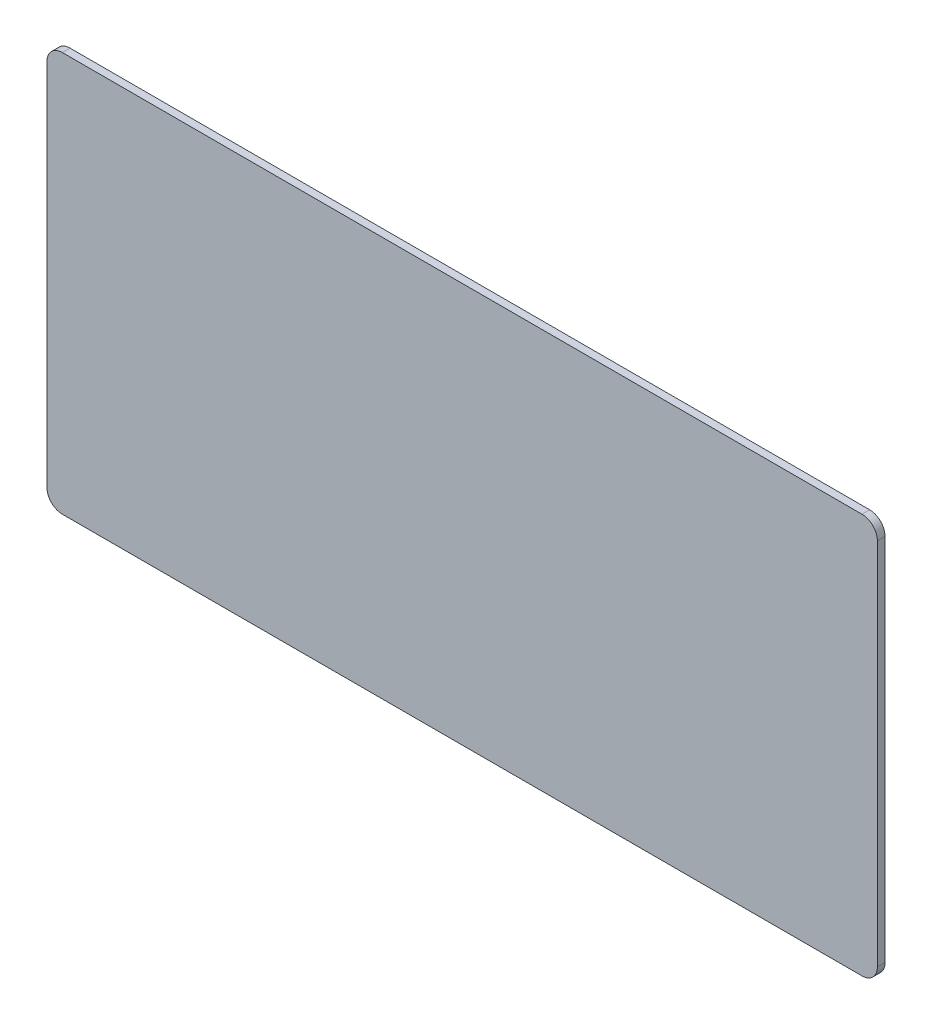
ISO-10303-21;
HEADER;
FILE_DESCRIPTION(('STEP AP214'),'2;1');
FILE_NAME('part.step','',(''),(''),'','','');
FILE_SCHEMA(('AUTOMOTIVE_DESIGN { 1 0 10303 214 1 1 1 1 }'));
ENDSEC;
DATA;
#1=APPLICATION_CONTEXT('core data for automotive mechanical design processes');
#2=APPLICATION_PROTOCOL_DEFINITION('international standard','automotive_design',2000,#1);
#3=PRODUCT_CONTEXT('',#1,'mechanical');
#4=PRODUCT('Part','Part','',(#3));
#5=PRODUCT_RELATED_PRODUCT_CATEGORY('part','',(#4));
#6=PRODUCT_DEFINITION_FORMATION('','',#4);
#7=PRODUCT_DEFINITION_CONTEXT('part definition',#1,'design');
#8=PRODUCT_DEFINITION('design','',#6,#7);
#9=PRODUCT_DEFINITION_SHAPE('','',#8);
#10=(LENGTH_UNIT() NAMED_UNIT(*) SI_UNIT(.MILLI.,.METRE.));
#11=(NAMED_UNIT(*) PLANE_ANGLE_UNIT() SI_UNIT($,.RADIAN.));
#12=(NAMED_UNIT(*) SI_UNIT($,.STERADIAN.) SOLID_ANGLE_UNIT());
#13=UNCERTAINTY_MEASURE_WITH_UNIT(LENGTH_MEASURE(1.E-05),#10,'distance_accuracy_value','');
#14=(GEOMETRIC_REPRESENTATION_CONTEXT(3) GLOBAL_UNCERTAINTY_ASSIGNED_CONTEXT((#13)) GLOBAL_UNIT_ASSIGNED_CONTEXT((#10,
#11,#12)) REPRESENTATION_CONTEXT('',''));
#15=CARTESIAN_POINT('',(0.,0.,0.));
#16=DIRECTION('',(0.,0.,1.));
#17=DIRECTION('',(1.,0.,0.));
#18=AXIS2_PLACEMENT_3D('',#15,#16,#17);
#19=CARTESIAN_POINT('',(270.,-130.,5.));
#20=DIRECTION('',(-1.,0.,0.));
#21=DIRECTION('',(0.,0.,1.));
#22=AXIS2_PLACEMENT_3D('',#19,#20,#21);
#23=PLANE('',#22);
#24=DIRECTION('',(0.,1.,0.));
#25=VECTOR('',#24,1.);
#26=CARTESIAN_POINT('',(270.,-130.,5.));
#27=LINE('',#26,#25);
#28=CARTESIAN_POINT('',(270.,-120.,5.));
#29=VERTEX_POINT('',#28);
#30=CARTESIAN_POINT('',(270.,120.,5.));
#31=VERTEX_POINT('',#30);
#32=EDGE_CURVE('E124',#29,#31,#27,.T.);
#33=ORIENTED_EDGE('',*,*,#32,.F.);
#34=DIRECTION('',(0.,0.,-1.));
#35=VECTOR('',#34,1.);
#36=CARTESIAN_POINT('',(270.,-120.,5.));
#37=LINE('',#36,#35);
#38=CARTESIAN_POINT('',(270.,-120.,0.));
#39=VERTEX_POINT('',#38);
#40=EDGE_CURVE('E150',#29,#39,#37,.T.);
#41=ORIENTED_EDGE('',*,*,#40,.T.);
#42=DIRECTION('',(0.,1.,0.));
#43=VECTOR('',#42,1.);
#44=CARTESIAN_POINT('',(270.,-130.,0.));
#45=LINE('',#44,#43);
#46=CARTESIAN_POINT('',(270.,120.,0.));
#47=VERTEX_POINT('',#46);
#48=EDGE_CURVE('E156',#39,#47,#45,.T.);
#49=ORIENTED_EDGE('',*,*,#48,.T.);
#50=DIRECTION('',(0.,0.,-1.));
#51=VECTOR('',#50,1.);
#52=CARTESIAN_POINT('',(270.,120.,5.));
#53=LINE('',#52,#51);
#54=EDGE_CURVE('E148',#47,#31,#53,.F.);
#55=ORIENTED_EDGE('',*,*,#54,.T.);
#56=EDGE_LOOP('',(#33,#41,#49,#55));
#57=FACE_BOUND('',#56,.T.);
#58=ADVANCED_FACE('F32',(#57),#23,.F.);
#59=CARTESIAN_POINT('',(-270.,130.,5.));
#60=DIRECTION('',(0.,-1.,0.));
#61=DIRECTION('',(0.,0.,-1.));
#62=AXIS2_PLACEMENT_3D('',#59,#60,#61);
#63=PLANE('',#62);
#64=DIRECTION('',(-1.,0.,0.));
#65=VECTOR('',#64,1.);
#66=CARTESIAN_POINT('',(-270.,130.,5.));
#67=LINE('',#66,#65);
#68=CARTESIAN_POINT('',(260.,130.,5.));
#69=VERTEX_POINT('',#68);
#70=CARTESIAN_POINT('',(-260.,130.,5.));
#71=VERTEX_POINT('',#70);
#72=EDGE_CURVE('E127',#69,#71,#67,.T.);
#73=ORIENTED_EDGE('',*,*,#72,.F.);
#74=DIRECTION('',(0.,0.,-1.));
#75=VECTOR('',#74,1.);
#76=CARTESIAN_POINT('',(260.,130.,5.));
#77=LINE('',#76,#75);
#78=CARTESIAN_POINT('',(260.,130.,0.));
#79=VERTEX_POINT('',#78);
#80=EDGE_CURVE('E11',#69,#79,#77,.T.);
#81=ORIENTED_EDGE('',*,*,#80,.T.);
#82=DIRECTION('',(-1.,0.,0.));
#83=VECTOR('',#82,1.);
#84=CARTESIAN_POINT('',(-270.,130.,0.));
#85=LINE('',#84,#83);
#86=CARTESIAN_POINT('',(-260.,130.,0.));
#87=VERTEX_POINT('',#86);
#88=EDGE_CURVE('E129',#79,#87,#85,.T.);
#89=ORIENTED_EDGE('',*,*,#88,.T.);
#90=DIRECTION('',(0.,0.,-1.));
#91=VECTOR('',#90,1.);
#92=CARTESIAN_POINT('',(-260.,130.,5.));
#93=LINE('',#92,#91);
#94=EDGE_CURVE('E40',#87,#71,#93,.F.);
#95=ORIENTED_EDGE('',*,*,#94,.T.);
#96=EDGE_LOOP('',(#73,#81,#89,#95));
#97=FACE_BOUND('',#96,.T.);
#98=ADVANCED_FACE('F175',(#97),#63,.F.);
#99=CARTESIAN_POINT('',(-270.,-130.,5.));
#100=DIRECTION('',(1.,0.,0.));
#101=DIRECTION('',(0.,0.,-1.));
#102=AXIS2_PLACEMENT_3D('',#99,#100,#101);
#103=PLANE('',#102);
#104=DIRECTION('',(0.,-1.,0.));
#105=VECTOR('',#104,1.);
#106=CARTESIAN_POINT('',(-270.,-130.,0.));
#107=LINE('',#106,#105);
#108=CARTESIAN_POINT('',(-270.,120.,0.));
#109=VERTEX_POINT('',#108);
#110=CARTESIAN_POINT('',(-270.,-120.,0.));
#111=VERTEX_POINT('',#110);
#112=EDGE_CURVE('E125',#109,#111,#107,.T.);
#113=ORIENTED_EDGE('',*,*,#112,.T.);
#114=DIRECTION('',(0.,0.,-1.));
#115=VECTOR('',#114,1.);
#116=CARTESIAN_POINT('',(-270.,-120.,5.));
#117=LINE('',#116,#115);
#118=CARTESIAN_POINT('',(-270.,-120.,5.));
#119=VERTEX_POINT('',#118);
#120=EDGE_CURVE('E103',#111,#119,#117,.F.);
#121=ORIENTED_EDGE('',*,*,#120,.T.);
#122=DIRECTION('',(0.,-1.,0.));
#123=VECTOR('',#122,1.);
#124=CARTESIAN_POINT('',(-270.,-130.,5.));
#125=LINE('',#124,#123);
#126=CARTESIAN_POINT('',(-270.,120.,5.));
#127=VERTEX_POINT('',#126);
#128=EDGE_CURVE('E164',#127,#119,#125,.T.);
#129=ORIENTED_EDGE('',*,*,#128,.F.);
#130=DIRECTION('',(0.,0.,-1.));
#131=VECTOR('',#130,1.);
#132=CARTESIAN_POINT('',(-270.,120.,5.));
#133=LINE('',#132,#131);
#134=EDGE_CURVE('E108',#127,#109,#133,.T.);
#135=ORIENTED_EDGE('',*,*,#134,.T.);
#136=EDGE_LOOP('',(#113,#121,#129,#135));
#137=FACE_BOUND('',#136,.T.);
#138=ADVANCED_FACE('F174',(#137),#103,.F.);
#139=CARTESIAN_POINT('',(-270.,-130.,5.));
#140=DIRECTION('',(0.,1.,0.));
#141=DIRECTION('',(0.,0.,1.));
#142=AXIS2_PLACEMENT_3D('',#139,#140,#141);
#143=PLANE('',#142);
#144=DIRECTION('',(1.,0.,0.));
#145=VECTOR('',#144,1.);
#146=CARTESIAN_POINT('',(-270.,-130.,5.));
#147=LINE('',#146,#145);
#148=CARTESIAN_POINT('',(-260.,-130.,5.));
#149=VERTEX_POINT('',#148);
#150=CARTESIAN_POINT('',(260.,-130.,5.));
#151=VERTEX_POINT('',#150);
#152=EDGE_CURVE('E118',#149,#151,#147,.T.);
#153=ORIENTED_EDGE('',*,*,#152,.F.);
#154=DIRECTION('',(0.,0.,-1.));
#155=VECTOR('',#154,1.);
#156=CARTESIAN_POINT('',(-260.,-130.,5.));
#157=LINE('',#156,#155);
#158=CARTESIAN_POINT('',(-260.,-130.,0.));
#159=VERTEX_POINT('',#158);
#160=EDGE_CURVE('E102',#149,#159,#157,.T.);
#161=ORIENTED_EDGE('',*,*,#160,.T.);
#162=DIRECTION('',(1.,0.,0.));
#163=VECTOR('',#162,1.);
#164=CARTESIAN_POINT('',(-270.,-130.,0.));
#165=LINE('',#164,#163);
#166=CARTESIAN_POINT('',(260.,-130.,0.));
#167=VERTEX_POINT('',#166);
#168=EDGE_CURVE('E115',#159,#167,#165,.T.);
#169=ORIENTED_EDGE('',*,*,#168,.T.);
#170=DIRECTION('',(0.,0.,-1.));
#171=VECTOR('',#170,1.);
#172=CARTESIAN_POINT('',(260.,-130.,5.));
#173=LINE('',#172,#171);
#174=EDGE_CURVE('E120',#167,#151,#173,.F.);
#175=ORIENTED_EDGE('',*,*,#174,.T.);
#176=EDGE_LOOP('',(#153,#161,#169,#175));
#177=FACE_BOUND('',#176,.T.);
#178=ADVANCED_FACE('F114',(#177),#143,.F.);
#179=CARTESIAN_POINT('',(0.,0.,5.));
#180=DIRECTION('',(0.,0.,-1.));
#181=DIRECTION('',(-1.,0.,0.));
#182=AXIS2_PLACEMENT_3D('',#179,#180,#181);
#183=PLANE('',#182);
#184=ORIENTED_EDGE('',*,*,#128,.T.);
#185=CARTESIAN_POINT('',(-260.,-120.,5.));
#186=DIRECTION('',(0.,0.,-1.));
#187=DIRECTION('',(-1.,0.,0.));
#188=AXIS2_PLACEMENT_3D('',#185,#186,#187);
#189=CIRCLE('',#188,10.);
#190=EDGE_CURVE('E146',#119,#149,#189,.F.);
#191=ORIENTED_EDGE('',*,*,#190,.T.);
#192=ORIENTED_EDGE('',*,*,#152,.T.);
#193=CARTESIAN_POINT('',(260.,-120.,5.));
#194=DIRECTION('',(0.,0.,-1.));
#195=DIRECTION('',(-1.,0.,0.));
#196=AXIS2_PLACEMENT_3D('',#193,#194,#195);
#197=CIRCLE('',#196,10.);
#198=EDGE_CURVE('E144',#151,#29,#197,.F.);
#199=ORIENTED_EDGE('',*,*,#198,.T.);
#200=ORIENTED_EDGE('',*,*,#32,.T.);
#201=CARTESIAN_POINT('',(260.,120.,5.));
#202=DIRECTION('',(0.,0.,-1.));
#203=DIRECTION('',(-1.,0.,0.));
#204=AXIS2_PLACEMENT_3D('',#201,#202,#203);
#205=CIRCLE('',#204,10.);
#206=EDGE_CURVE('E53',#31,#69,#205,.F.);
#207=ORIENTED_EDGE('',*,*,#206,.T.);
#208=ORIENTED_EDGE('',*,*,#72,.T.);
#209=CARTESIAN_POINT('',(-260.,120.,5.));
#210=DIRECTION('',(0.,0.,-1.));
#211=DIRECTION('',(-1.,0.,0.));
#212=AXIS2_PLACEMENT_3D('',#209,#210,#211);
#213=CIRCLE('',#212,10.);
#214=EDGE_CURVE('E141',#71,#127,#213,.F.);
#215=ORIENTED_EDGE('',*,*,#214,.T.);
#216=EDGE_LOOP('',(#184,#191,#192,#199,#200,#207,#208,#215));
#217=FACE_BOUND('',#216,.T.);
#218=ADVANCED_FACE('F168',(#217),#183,.F.);
#219=CARTESIAN_POINT('',(0.,0.,0.));
#220=DIRECTION('',(0.,0.,-1.));
#221=DIRECTION('',(-1.,0.,0.));
#222=AXIS2_PLACEMENT_3D('',#219,#220,#221);
#223=PLANE('',#222);
#224=ORIENTED_EDGE('',*,*,#168,.F.);
#225=CARTESIAN_POINT('',(-260.,-120.,0.));
#226=DIRECTION('',(0.,0.,-1.));
#227=DIRECTION('',(-1.,0.,0.));
#228=AXIS2_PLACEMENT_3D('',#225,#226,#227);
#229=CIRCLE('',#228,10.);
#230=EDGE_CURVE('E98',#159,#111,#229,.T.);
#231=ORIENTED_EDGE('',*,*,#230,.T.);
#232=ORIENTED_EDGE('',*,*,#112,.F.);
#233=CARTESIAN_POINT('',(-260.,120.,0.));
#234=DIRECTION('',(0.,0.,-1.));
#235=DIRECTION('',(-1.,0.,0.));
#236=AXIS2_PLACEMENT_3D('',#233,#234,#235);
#237=CIRCLE('',#236,10.);
#238=EDGE_CURVE('E119',#109,#87,#237,.T.);
#239=ORIENTED_EDGE('',*,*,#238,.T.);
#240=ORIENTED_EDGE('',*,*,#88,.F.);
#241=CARTESIAN_POINT('',(260.,120.,0.));
#242=DIRECTION('',(0.,0.,-1.));
#243=DIRECTION('',(-1.,0.,0.));
#244=AXIS2_PLACEMENT_3D('',#241,#242,#243);
#245=CIRCLE('',#244,10.);
#246=EDGE_CURVE('E135',#79,#47,#245,.T.);
#247=ORIENTED_EDGE('',*,*,#246,.T.);
#248=ORIENTED_EDGE('',*,*,#48,.F.);
#249=CARTESIAN_POINT('',(260.,-120.,0.));
#250=DIRECTION('',(0.,0.,-1.));
#251=DIRECTION('',(-1.,0.,0.));
#252=AXIS2_PLACEMENT_3D('',#249,#250,#251);
#253=CIRCLE('',#252,10.);
#254=EDGE_CURVE('E109',#39,#167,#253,.T.);
#255=ORIENTED_EDGE('',*,*,#254,.T.);
#256=EDGE_LOOP('',(#224,#231,#232,#239,#240,#247,#248,#255));
#257=FACE_BOUND('',#256,.T.);
#258=ADVANCED_FACE('F122',(#257),#223,.T.);
#259=CARTESIAN_POINT('',(-260.,-120.,5.));
#260=DIRECTION('',(0.,0.,-1.));
#261=DIRECTION('',(-1.,0.,0.));
#262=AXIS2_PLACEMENT_3D('',#259,#260,#261);
#263=CYLINDRICAL_SURFACE('',#262,10.);
#264=ORIENTED_EDGE('',*,*,#190,.F.);
#265=ORIENTED_EDGE('',*,*,#120,.F.);
#266=ORIENTED_EDGE('',*,*,#230,.F.);
#267=ORIENTED_EDGE('',*,*,#160,.F.);
#268=EDGE_LOOP('',(#264,#265,#266,#267));
#269=FACE_BOUND('',#268,.T.);
#270=ADVANCED_FACE('F101',(#269),#263,.T.);
#271=CARTESIAN_POINT('',(260.,-120.,5.));
#272=DIRECTION('',(0.,0.,-1.));
#273=DIRECTION('',(-1.,0.,0.));
#274=AXIS2_PLACEMENT_3D('',#271,#272,#273);
#275=CYLINDRICAL_SURFACE('',#274,10.);
#276=ORIENTED_EDGE('',*,*,#198,.F.);
#277=ORIENTED_EDGE('',*,*,#174,.F.);
#278=ORIENTED_EDGE('',*,*,#254,.F.);
#279=ORIENTED_EDGE('',*,*,#40,.F.);
#280=EDGE_LOOP('',(#276,#277,#278,#279));
#281=FACE_BOUND('',#280,.T.);
#282=ADVANCED_FACE('F178',(#281),#275,.T.);
#283=CARTESIAN_POINT('',(260.,120.,5.));
#284=DIRECTION('',(0.,0.,-1.));
#285=DIRECTION('',(-1.,0.,0.));
#286=AXIS2_PLACEMENT_3D('',#283,#284,#285);
#287=CYLINDRICAL_SURFACE('',#286,10.);
#288=ORIENTED_EDGE('',*,*,#206,.F.);
#289=ORIENTED_EDGE('',*,*,#54,.F.);
#290=ORIENTED_EDGE('',*,*,#246,.F.);
#291=ORIENTED_EDGE('',*,*,#80,.F.);
#292=EDGE_LOOP('',(#288,#289,#290,#291));
#293=FACE_BOUND('',#292,.T.);
#294=ADVANCED_FACE('F177',(#293),#287,.T.);
#295=CARTESIAN_POINT('',(-260.,120.,5.));
#296=DIRECTION('',(0.,0.,-1.));
#297=DIRECTION('',(-1.,0.,0.));
#298=AXIS2_PLACEMENT_3D('',#295,#296,#297);
#299=CYLINDRICAL_SURFACE('',#298,10.);
#300=ORIENTED_EDGE('',*,*,#214,.F.);
#301=ORIENTED_EDGE('',*,*,#94,.F.);
#302=ORIENTED_EDGE('',*,*,#238,.F.);
#303=ORIENTED_EDGE('',*,*,#134,.F.);
#304=EDGE_LOOP('',(#300,#301,#302,#303));
#305=FACE_BOUND('',#304,.T.);
#306=ADVANCED_FACE('F34',(#305),#299,.T.);
#307=CLOSED_SHELL('',(#58,#98,#138,#178,#218,#258,#270,#282,#294,#306));
#308=MANIFOLD_SOLID_BREP('B2',#307);
#309=ADVANCED_BREP_SHAPE_REPRESENTATION('',(#18,#308),#14);
#310=SHAPE_DEFINITION_REPRESENTATION(#9,#309);
ENDSEC;
END-ISO-10303-21;
